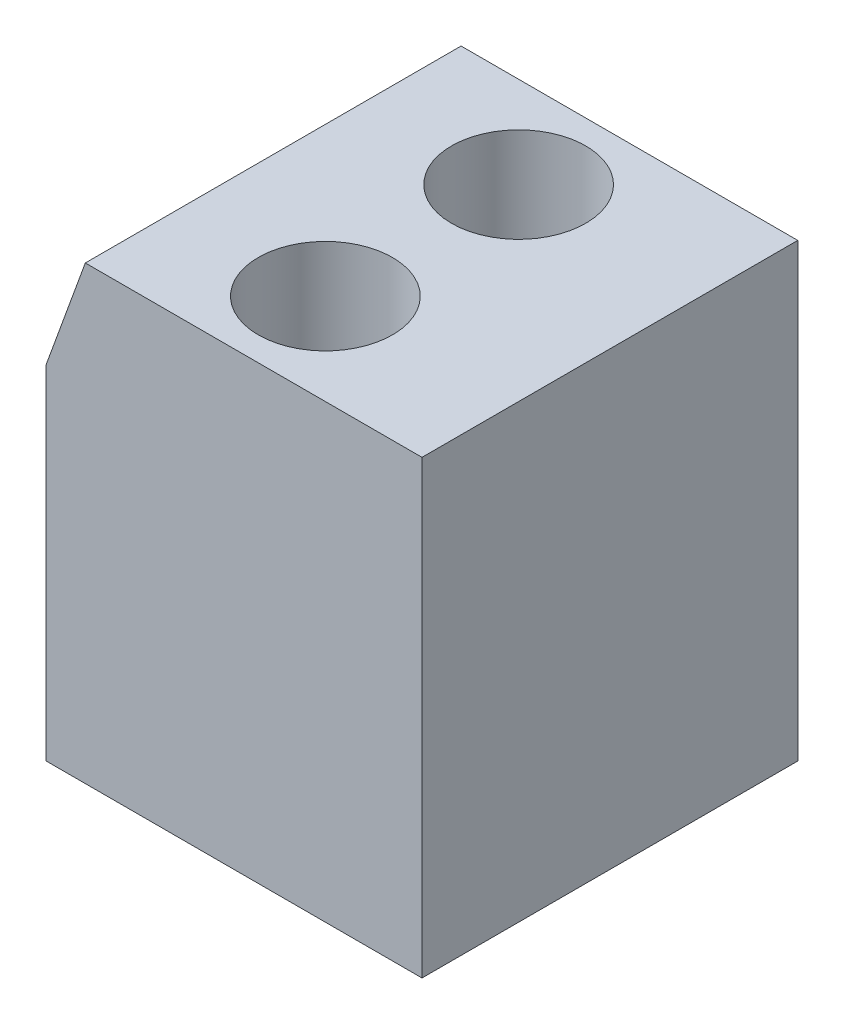
ISO-10303-21;
HEADER;
FILE_DESCRIPTION(('STEP AP214'),'2;1');
FILE_NAME('part.step','',(''),(''),'','','');
FILE_SCHEMA(('AUTOMOTIVE_DESIGN { 1 0 10303 214 1 1 1 1 }'));
ENDSEC;
DATA;
#1=APPLICATION_CONTEXT('core data for automotive mechanical design processes');
#2=APPLICATION_PROTOCOL_DEFINITION('international standard','automotive_design',2000,#1);
#3=PRODUCT_CONTEXT('',#1,'mechanical');
#4=PRODUCT('Part','Part','',(#3));
#5=PRODUCT_RELATED_PRODUCT_CATEGORY('part','',(#4));
#6=PRODUCT_DEFINITION_FORMATION('','',#4);
#7=PRODUCT_DEFINITION_CONTEXT('part definition',#1,'design');
#8=PRODUCT_DEFINITION('design','',#6,#7);
#9=PRODUCT_DEFINITION_SHAPE('','',#8);
#10=(LENGTH_UNIT() NAMED_UNIT(*) SI_UNIT(.MILLI.,.METRE.));
#11=(NAMED_UNIT(*) PLANE_ANGLE_UNIT() SI_UNIT($,.RADIAN.));
#12=(NAMED_UNIT(*) SI_UNIT($,.STERADIAN.) SOLID_ANGLE_UNIT());
#13=UNCERTAINTY_MEASURE_WITH_UNIT(LENGTH_MEASURE(1.E-05),#10,'distance_accuracy_value','');
#14=(GEOMETRIC_REPRESENTATION_CONTEXT(3) GLOBAL_UNCERTAINTY_ASSIGNED_CONTEXT((#13)) GLOBAL_UNIT_ASSIGNED_CONTEXT((#10,
#11,#12)) REPRESENTATION_CONTEXT('',''));
#15=CARTESIAN_POINT('',(0.,0.,0.));
#16=DIRECTION('',(0.,0.,1.));
#17=DIRECTION('',(1.,0.,0.));
#18=AXIS2_PLACEMENT_3D('',#15,#16,#17);
#19=CARTESIAN_POINT('',(0.,8.4,0.));
#20=DIRECTION('',(1.,0.,0.));
#21=DIRECTION('',(0.,0.,-1.));
#22=AXIS2_PLACEMENT_3D('',#19,#20,#21);
#23=PLANE('',#22);
#24=DIRECTION('',(0.,-1.,0.));
#25=VECTOR('',#24,1.);
#26=CARTESIAN_POINT('',(0.,8.4,7.));
#27=LINE('',#26,#25);
#28=CARTESIAN_POINT('',(0.,6.39999999999998,7.));
#29=VERTEX_POINT('',#28);
#30=CARTESIAN_POINT('',(0.,0.,7.));
#31=VERTEX_POINT('',#30);
#32=EDGE_CURVE('E94',#29,#31,#27,.T.);
#33=ORIENTED_EDGE('',*,*,#32,.F.);
#34=DIRECTION('',(0.,0.,-1.));
#35=VECTOR('',#34,1.);
#36=CARTESIAN_POINT('',(0.,6.39999999999998,0.));
#37=LINE('',#36,#35);
#38=CARTESIAN_POINT('',(0.,6.39999999999998,0.));
#39=VERTEX_POINT('',#38);
#40=EDGE_CURVE('E40',#29,#39,#37,.T.);
#41=ORIENTED_EDGE('',*,*,#40,.T.);
#42=DIRECTION('',(0.,-1.,0.));
#43=VECTOR('',#42,1.);
#44=CARTESIAN_POINT('',(0.,8.4,0.));
#45=LINE('',#44,#43);
#46=CARTESIAN_POINT('',(0.,0.,0.));
#47=VERTEX_POINT('',#46);
#48=EDGE_CURVE('E102',#39,#47,#45,.T.);
#49=ORIENTED_EDGE('',*,*,#48,.T.);
#50=DIRECTION('',(0.,0.,1.));
#51=VECTOR('',#50,1.);
#52=CARTESIAN_POINT('',(0.,0.,0.));
#53=LINE('',#52,#51);
#54=EDGE_CURVE('E106',#47,#31,#53,.T.);
#55=ORIENTED_EDGE('',*,*,#54,.T.);
#56=EDGE_LOOP('',(#33,#41,#49,#55));
#57=FACE_BOUND('',#56,.T.);
#58=ADVANCED_FACE('F32',(#57),#23,.F.);
#59=CARTESIAN_POINT('',(0.,8.4,7.));
#60=DIRECTION('',(0.,0.,-1.));
#61=DIRECTION('',(-1.,0.,0.));
#62=AXIS2_PLACEMENT_3D('',#59,#60,#61);
#63=PLANE('',#62);
#64=DIRECTION('',(1.,0.,0.));
#65=VECTOR('',#64,1.);
#66=CARTESIAN_POINT('',(0.,8.4,7.));
#67=LINE('',#66,#65);
#68=CARTESIAN_POINT('',(0.727940468532408,8.4,7.));
#69=VERTEX_POINT('',#68);
#70=CARTESIAN_POINT('',(7.,8.4,7.));
#71=VERTEX_POINT('',#70);
#72=EDGE_CURVE('E76',#69,#71,#67,.T.);
#73=ORIENTED_EDGE('',*,*,#72,.F.);
#74=DIRECTION('',(-0.342020143325667,-0.939692620785909,0.));
#75=VECTOR('',#74,1.);
#76=CARTESIAN_POINT('',(0.727940468532408,8.4,7.));
#77=LINE('',#76,#75);
#78=EDGE_CURVE('E54',#69,#29,#77,.T.);
#79=ORIENTED_EDGE('',*,*,#78,.T.);
#80=ORIENTED_EDGE('',*,*,#32,.T.);
#81=DIRECTION('',(1.,0.,0.));
#82=VECTOR('',#81,1.);
#83=CARTESIAN_POINT('',(0.,0.,7.));
#84=LINE('',#83,#82);
#85=CARTESIAN_POINT('',(7.,0.,7.));
#86=VERTEX_POINT('',#85);
#87=EDGE_CURVE('E91',#31,#86,#84,.T.);
#88=ORIENTED_EDGE('',*,*,#87,.T.);
#89=DIRECTION('',(0.,-1.,0.));
#90=VECTOR('',#89,1.);
#91=CARTESIAN_POINT('',(7.,8.4,7.));
#92=LINE('',#91,#90);
#93=EDGE_CURVE('E88',#71,#86,#92,.T.);
#94=ORIENTED_EDGE('',*,*,#93,.F.);
#95=EDGE_LOOP('',(#73,#79,#80,#88,#94));
#96=FACE_BOUND('',#95,.T.);
#97=ADVANCED_FACE('F89',(#96),#63,.F.);
#98=CARTESIAN_POINT('',(7.,8.4,0.));
#99=DIRECTION('',(-1.,0.,0.));
#100=DIRECTION('',(0.,0.,1.));
#101=AXIS2_PLACEMENT_3D('',#98,#99,#100);
#102=PLANE('',#101);
#103=DIRECTION('',(0.,0.,-1.));
#104=VECTOR('',#103,1.);
#105=CARTESIAN_POINT('',(7.,0.,0.));
#106=LINE('',#105,#104);
#107=CARTESIAN_POINT('',(7.,0.,0.));
#108=VERTEX_POINT('',#107);
#109=EDGE_CURVE('E111',#86,#108,#106,.T.);
#110=ORIENTED_EDGE('',*,*,#109,.T.);
#111=DIRECTION('',(0.,-1.,0.));
#112=VECTOR('',#111,1.);
#113=CARTESIAN_POINT('',(7.,8.4,0.));
#114=LINE('',#113,#112);
#115=CARTESIAN_POINT('',(7.,8.4,0.));
#116=VERTEX_POINT('',#115);
#117=EDGE_CURVE('E95',#116,#108,#114,.T.);
#118=ORIENTED_EDGE('',*,*,#117,.F.);
#119=DIRECTION('',(0.,0.,-1.));
#120=VECTOR('',#119,1.);
#121=CARTESIAN_POINT('',(7.,8.4,0.));
#122=LINE('',#121,#120);
#123=EDGE_CURVE('E81',#71,#116,#122,.T.);
#124=ORIENTED_EDGE('',*,*,#123,.F.);
#125=ORIENTED_EDGE('',*,*,#93,.T.);
#126=EDGE_LOOP('',(#110,#118,#124,#125));
#127=FACE_BOUND('',#126,.T.);
#128=ADVANCED_FACE('F97',(#127),#102,.F.);
#129=CARTESIAN_POINT('',(0.,8.4,0.));
#130=DIRECTION('',(0.,0.,1.));
#131=DIRECTION('',(1.,0.,0.));
#132=AXIS2_PLACEMENT_3D('',#129,#130,#131);
#133=PLANE('',#132);
#134=ORIENTED_EDGE('',*,*,#48,.F.);
#135=DIRECTION('',(0.342020143325667,0.939692620785909,0.));
#136=VECTOR('',#135,1.);
#137=CARTESIAN_POINT('',(0.727940468532407,8.4,0.));
#138=LINE('',#137,#136);
#139=CARTESIAN_POINT('',(0.727940468532407,8.4,0.));
#140=VERTEX_POINT('',#139);
#141=EDGE_CURVE('E11',#39,#140,#138,.T.);
#142=ORIENTED_EDGE('',*,*,#141,.T.);
#143=DIRECTION('',(-1.,0.,0.));
#144=VECTOR('',#143,1.);
#145=CARTESIAN_POINT('',(0.,8.4,0.));
#146=LINE('',#145,#144);
#147=EDGE_CURVE('E100',#116,#140,#146,.T.);
#148=ORIENTED_EDGE('',*,*,#147,.F.);
#149=ORIENTED_EDGE('',*,*,#117,.T.);
#150=DIRECTION('',(-1.,0.,0.));
#151=VECTOR('',#150,1.);
#152=CARTESIAN_POINT('',(0.,0.,0.));
#153=LINE('',#152,#151);
#154=EDGE_CURVE('E85',#108,#47,#153,.T.);
#155=ORIENTED_EDGE('',*,*,#154,.T.);
#156=EDGE_LOOP('',(#134,#142,#148,#149,#155));
#157=FACE_BOUND('',#156,.T.);
#158=ADVANCED_FACE('F125',(#157),#133,.F.);
#159=CARTESIAN_POINT('',(0.,8.4,0.));
#160=DIRECTION('',(0.,1.,0.));
#161=DIRECTION('',(0.,0.,1.));
#162=AXIS2_PLACEMENT_3D('',#159,#160,#161);
#163=PLANE('',#162);
#164=CARTESIAN_POINT('',(3.5,8.4,1.7));
#165=DIRECTION('',(0.,1.,0.));
#166=DIRECTION('',(0.,0.,1.));
#167=AXIS2_PLACEMENT_3D('',#164,#165,#166);
#168=CIRCLE('',#167,1.25);
#169=CARTESIAN_POINT('',(3.5,8.4,2.95));
#170=VERTEX_POINT('',#169);
#171=EDGE_CURVE('E164',#170,#170,#168,.T.);
#172=ORIENTED_EDGE('',*,*,#171,.F.);
#173=EDGE_LOOP('',(#172));
#174=FACE_BOUND('',#173,.T.);
#175=CARTESIAN_POINT('',(3.5,8.4,5.3));
#176=DIRECTION('',(0.,1.,0.));
#177=DIRECTION('',(0.,0.,1.));
#178=AXIS2_PLACEMENT_3D('',#175,#176,#177);
#179=CIRCLE('',#178,1.25);
#180=CARTESIAN_POINT('',(3.5,8.4,6.55));
#181=VERTEX_POINT('',#180);
#182=EDGE_CURVE('E171',#181,#181,#179,.T.);
#183=ORIENTED_EDGE('',*,*,#182,.F.);
#184=EDGE_LOOP('',(#183));
#185=FACE_BOUND('',#184,.T.);
#186=ORIENTED_EDGE('',*,*,#147,.T.);
#187=DIRECTION('',(0.,0.,1.));
#188=VECTOR('',#187,1.);
#189=CARTESIAN_POINT('',(0.727940468532408,8.4,7.));
#190=LINE('',#189,#188);
#191=EDGE_CURVE('E84',#140,#69,#190,.T.);
#192=ORIENTED_EDGE('',*,*,#191,.T.);
#193=ORIENTED_EDGE('',*,*,#72,.T.);
#194=ORIENTED_EDGE('',*,*,#123,.T.);
#195=EDGE_LOOP('',(#186,#192,#193,#194));
#196=FACE_BOUND('',#195,.T.);
#197=ADVANCED_FACE('F79',(#174,#185,#196),#163,.T.);
#198=CARTESIAN_POINT('',(0.,0.,0.));
#199=DIRECTION('',(0.,1.,0.));
#200=DIRECTION('',(0.,0.,1.));
#201=AXIS2_PLACEMENT_3D('',#198,#199,#200);
#202=PLANE('',#201);
#203=ORIENTED_EDGE('',*,*,#54,.F.);
#204=ORIENTED_EDGE('',*,*,#154,.F.);
#205=ORIENTED_EDGE('',*,*,#109,.F.);
#206=ORIENTED_EDGE('',*,*,#87,.F.);
#207=EDGE_LOOP('',(#203,#204,#205,#206));
#208=FACE_BOUND('',#207,.T.);
#209=ADVANCED_FACE('F121',(#208),#202,.F.);
#210=CARTESIAN_POINT('',(0.727940468532407,8.4,0.));
#211=DIRECTION('',(-0.939692620785909,0.342020143325667,0.));
#212=DIRECTION('',(0.,0.,-1.));
#213=AXIS2_PLACEMENT_3D('',#210,#211,#212);
#214=PLANE('',#213);
#215=ORIENTED_EDGE('',*,*,#141,.F.);
#216=ORIENTED_EDGE('',*,*,#40,.F.);
#217=ORIENTED_EDGE('',*,*,#78,.F.);
#218=ORIENTED_EDGE('',*,*,#191,.F.);
#219=EDGE_LOOP('',(#215,#216,#217,#218));
#220=FACE_BOUND('',#219,.T.);
#221=ADVANCED_FACE('F34',(#220),#214,.T.);
#222=CARTESIAN_POINT('',(3.5,4.4,5.3));
#223=DIRECTION('',(0.,1.,0.));
#224=DIRECTION('',(0.,0.,1.));
#225=AXIS2_PLACEMENT_3D('',#222,#223,#224);
#226=CYLINDRICAL_SURFACE('',#225,1.25);
#227=CARTESIAN_POINT('',(3.5,4.4,5.3));
#228=DIRECTION('',(0.,1.,0.));
#229=DIRECTION('',(0.,0.,1.));
#230=AXIS2_PLACEMENT_3D('',#227,#228,#229);
#231=CIRCLE('',#230,1.25);
#232=CARTESIAN_POINT('',(3.5,4.4,6.55));
#233=VERTEX_POINT('',#232);
#234=EDGE_CURVE('E167',#233,#233,#231,.T.);
#235=ORIENTED_EDGE('',*,*,#234,.F.);
#236=EDGE_LOOP('',(#235));
#237=FACE_BOUND('',#236,.T.);
#238=ORIENTED_EDGE('',*,*,#182,.T.);
#239=EDGE_LOOP('',(#238));
#240=FACE_BOUND('',#239,.T.);
#241=ADVANCED_FACE('F128',(#237,#240),#226,.F.);
#242=CARTESIAN_POINT('',(3.5,4.4,5.3));
#243=DIRECTION('',(0.,1.,0.));
#244=DIRECTION('',(0.,0.,1.));
#245=AXIS2_PLACEMENT_3D('',#242,#243,#244);
#246=PLANE('',#245);
#247=ORIENTED_EDGE('',*,*,#234,.T.);
#248=EDGE_LOOP('',(#247));
#249=FACE_BOUND('',#248,.T.);
#250=ADVANCED_FACE('F133',(#249),#246,.T.);
#251=CARTESIAN_POINT('',(3.5,4.4,1.7));
#252=DIRECTION('',(0.,1.,0.));
#253=DIRECTION('',(0.,0.,1.));
#254=AXIS2_PLACEMENT_3D('',#251,#252,#253);
#255=CYLINDRICAL_SURFACE('',#254,1.25);
#256=CARTESIAN_POINT('',(3.5,4.4,1.7));
#257=DIRECTION('',(0.,1.,0.));
#258=DIRECTION('',(0.,0.,1.));
#259=AXIS2_PLACEMENT_3D('',#256,#257,#258);
#260=CIRCLE('',#259,1.25);
#261=CARTESIAN_POINT('',(3.5,4.4,2.95));
#262=VERTEX_POINT('',#261);
#263=EDGE_CURVE('E109',#262,#262,#260,.T.);
#264=ORIENTED_EDGE('',*,*,#263,.F.);
#265=EDGE_LOOP('',(#264));
#266=FACE_BOUND('',#265,.T.);
#267=ORIENTED_EDGE('',*,*,#171,.T.);
#268=EDGE_LOOP('',(#267));
#269=FACE_BOUND('',#268,.T.);
#270=ADVANCED_FACE('F152',(#266,#269),#255,.F.);
#271=CARTESIAN_POINT('',(3.5,4.4,1.7));
#272=DIRECTION('',(0.,1.,0.));
#273=DIRECTION('',(0.,0.,1.));
#274=AXIS2_PLACEMENT_3D('',#271,#272,#273);
#275=PLANE('',#274);
#276=ORIENTED_EDGE('',*,*,#263,.T.);
#277=EDGE_LOOP('',(#276));
#278=FACE_BOUND('',#277,.T.);
#279=ADVANCED_FACE('F156',(#278),#275,.T.);
#280=CLOSED_SHELL('',(#58,#97,#128,#158,#197,#209,#221,#241,#250,#270,#279));
#281=MANIFOLD_SOLID_BREP('B2',#280);
#282=ADVANCED_BREP_SHAPE_REPRESENTATION('',(#18,#281),#14);
#283=SHAPE_DEFINITION_REPRESENTATION(#9,#282);
ENDSEC;
END-ISO-10303-21;
